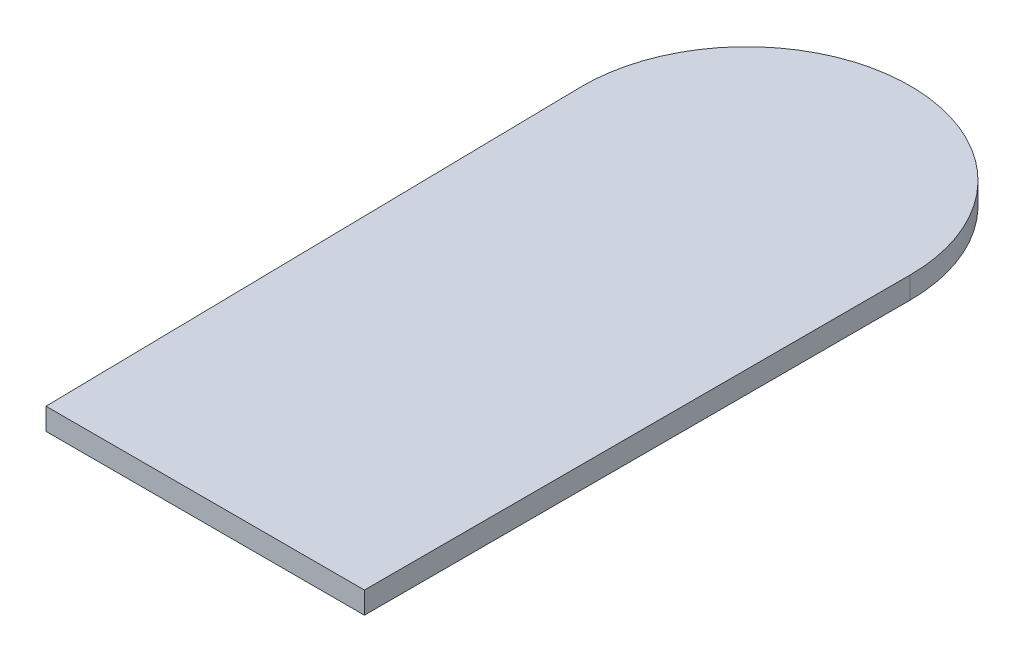
ISO-10303-21;
HEADER;
FILE_DESCRIPTION(('STEP AP214'),'2;1');
FILE_NAME('part.step','',(''),(''),'','','');
FILE_SCHEMA(('AUTOMOTIVE_DESIGN { 1 0 10303 214 1 1 1 1 }'));
ENDSEC;
DATA;
#1=APPLICATION_CONTEXT('core data for automotive mechanical design processes');
#2=APPLICATION_PROTOCOL_DEFINITION('international standard','automotive_design',2000,#1);
#3=PRODUCT_CONTEXT('',#1,'mechanical');
#4=PRODUCT('Part','Part','',(#3));
#5=PRODUCT_RELATED_PRODUCT_CATEGORY('part','',(#4));
#6=PRODUCT_DEFINITION_FORMATION('','',#4);
#7=PRODUCT_DEFINITION_CONTEXT('part definition',#1,'design');
#8=PRODUCT_DEFINITION('design','',#6,#7);
#9=PRODUCT_DEFINITION_SHAPE('','',#8);
#10=(LENGTH_UNIT() NAMED_UNIT(*) SI_UNIT(.MILLI.,.METRE.));
#11=(NAMED_UNIT(*) PLANE_ANGLE_UNIT() SI_UNIT($,.RADIAN.));
#12=(NAMED_UNIT(*) SI_UNIT($,.STERADIAN.) SOLID_ANGLE_UNIT());
#13=UNCERTAINTY_MEASURE_WITH_UNIT(LENGTH_MEASURE(1.E-05),#10,'distance_accuracy_value','');
#14=(GEOMETRIC_REPRESENTATION_CONTEXT(3) GLOBAL_UNCERTAINTY_ASSIGNED_CONTEXT((#13)) GLOBAL_UNIT_ASSIGNED_CONTEXT((#10,
#11,#12)) REPRESENTATION_CONTEXT('',''));
#15=CARTESIAN_POINT('',(0.,0.,0.));
#16=DIRECTION('',(0.,0.,1.));
#17=DIRECTION('',(1.,0.,0.));
#18=AXIS2_PLACEMENT_3D('',#15,#16,#17);
#19=CARTESIAN_POINT('',(-22.4968800304198,3.,0.374685063620242));
#20=DIRECTION('',(0.999861334685323,0.,-0.0166526694942331));
#21=DIRECTION('',(-0.0166526694942331,0.,-0.999861334685323));
#22=AXIS2_PLACEMENT_3D('',#19,#20,#21);
#23=PLANE('',#22);
#24=DIRECTION('',(0.0166526694942331,0.,0.999861334685323));
#25=VECTOR('',#24,1.);
#26=CARTESIAN_POINT('',(-22.4968800304198,0.,0.374685063620242));
#27=LINE('',#26,#25);
#28=CARTESIAN_POINT('',(-22.4968800304198,0.,0.374685063620237));
#29=VERTEX_POINT('',#28);
#30=CARTESIAN_POINT('',(-21.2539969801119,0.,75.));
#31=VERTEX_POINT('',#30);
#32=EDGE_CURVE('E102',#29,#31,#27,.T.);
#33=ORIENTED_EDGE('',*,*,#32,.T.);
#34=DIRECTION('',(0.,-1.,0.));
#35=VECTOR('',#34,1.);
#36=CARTESIAN_POINT('',(-21.2539969801119,3.,75.));
#37=LINE('',#36,#35);
#38=CARTESIAN_POINT('',(-21.2539969801119,3.,75.));
#39=VERTEX_POINT('',#38);
#40=EDGE_CURVE('E11',#39,#31,#37,.T.);
#41=ORIENTED_EDGE('',*,*,#40,.F.);
#42=DIRECTION('',(0.0166526694942331,0.,0.999861334685323));
#43=VECTOR('',#42,1.);
#44=CARTESIAN_POINT('',(-22.4968800304198,3.,0.374685063620242));
#45=LINE('',#44,#43);
#46=CARTESIAN_POINT('',(-22.4968800304198,3.,0.374685063620237));
#47=VERTEX_POINT('',#46);
#48=EDGE_CURVE('E88',#47,#39,#45,.T.);
#49=ORIENTED_EDGE('',*,*,#48,.F.);
#50=DIRECTION('',(0.,-1.,0.));
#51=VECTOR('',#50,1.);
#52=CARTESIAN_POINT('',(-22.4968800304198,3.,0.374685063620237));
#53=LINE('',#52,#51);
#54=EDGE_CURVE('E55',#47,#29,#53,.T.);
#55=ORIENTED_EDGE('',*,*,#54,.T.);
#56=EDGE_LOOP('',(#33,#41,#49,#55));
#57=FACE_BOUND('',#56,.T.);
#58=ADVANCED_FACE('F39',(#57),#23,.F.);
#59=CARTESIAN_POINT('',(-21.2539969801119,3.,75.));
#60=DIRECTION('',(0.,0.,-1.));
#61=DIRECTION('',(-1.,0.,0.));
#62=AXIS2_PLACEMENT_3D('',#59,#60,#61);
#63=PLANE('',#62);
#64=DIRECTION('',(1.,0.,0.));
#65=VECTOR('',#64,1.);
#66=CARTESIAN_POINT('',(-21.2539969801119,0.,75.));
#67=LINE('',#66,#65);
#68=CARTESIAN_POINT('',(22.5,0.,75.));
#69=VERTEX_POINT('',#68);
#70=EDGE_CURVE('E93',#31,#69,#67,.T.);
#71=ORIENTED_EDGE('',*,*,#70,.T.);
#72=DIRECTION('',(0.,-1.,0.));
#73=VECTOR('',#72,1.);
#74=CARTESIAN_POINT('',(22.5,3.,75.));
#75=LINE('',#74,#73);
#76=CARTESIAN_POINT('',(22.5,3.,75.));
#77=VERTEX_POINT('',#76);
#78=EDGE_CURVE('E47',#77,#69,#75,.T.);
#79=ORIENTED_EDGE('',*,*,#78,.F.);
#80=DIRECTION('',(1.,0.,0.));
#81=VECTOR('',#80,1.);
#82=CARTESIAN_POINT('',(-21.2539969801119,3.,75.));
#83=LINE('',#82,#81);
#84=EDGE_CURVE('E81',#39,#77,#83,.T.);
#85=ORIENTED_EDGE('',*,*,#84,.F.);
#86=ORIENTED_EDGE('',*,*,#40,.T.);
#87=EDGE_LOOP('',(#71,#79,#85,#86));
#88=FACE_BOUND('',#87,.T.);
#89=ADVANCED_FACE('F92',(#88),#63,.F.);
#90=CARTESIAN_POINT('',(22.5,3.,75.));
#91=DIRECTION('',(-1.,0.,0.));
#92=DIRECTION('',(0.,0.,1.));
#93=AXIS2_PLACEMENT_3D('',#90,#91,#92);
#94=PLANE('',#93);
#95=DIRECTION('',(0.,0.,-1.));
#96=VECTOR('',#95,1.);
#97=CARTESIAN_POINT('',(22.5,0.,75.));
#98=LINE('',#97,#96);
#99=CARTESIAN_POINT('',(22.5,0.,0.));
#100=VERTEX_POINT('',#99);
#101=EDGE_CURVE('E105',#69,#100,#98,.T.);
#102=ORIENTED_EDGE('',*,*,#101,.T.);
#103=DIRECTION('',(0.,-1.,0.));
#104=VECTOR('',#103,1.);
#105=CARTESIAN_POINT('',(22.5,3.,0.));
#106=LINE('',#105,#104);
#107=CARTESIAN_POINT('',(22.5,3.,0.));
#108=VERTEX_POINT('',#107);
#109=EDGE_CURVE('E70',#108,#100,#106,.T.);
#110=ORIENTED_EDGE('',*,*,#109,.F.);
#111=DIRECTION('',(0.,0.,-1.));
#112=VECTOR('',#111,1.);
#113=CARTESIAN_POINT('',(22.5,3.,75.));
#114=LINE('',#113,#112);
#115=EDGE_CURVE('E87',#77,#108,#114,.T.);
#116=ORIENTED_EDGE('',*,*,#115,.F.);
#117=ORIENTED_EDGE('',*,*,#78,.T.);
#118=EDGE_LOOP('',(#102,#110,#116,#117));
#119=FACE_BOUND('',#118,.T.);
#120=ADVANCED_FACE('F96',(#119),#94,.F.);
#121=CARTESIAN_POINT('',(0.,3.,0.));
#122=DIRECTION('',(0.,-1.,0.));
#123=DIRECTION('',(0.,0.,-1.));
#124=AXIS2_PLACEMENT_3D('',#121,#122,#123);
#125=CYLINDRICAL_SURFACE('',#124,22.5);
#126=CARTESIAN_POINT('',(0.,0.,0.));
#127=DIRECTION('',(0.,-1.,0.));
#128=DIRECTION('',(0.,0.,-1.));
#129=AXIS2_PLACEMENT_3D('',#126,#127,#128);
#130=CIRCLE('',#129,22.5);
#131=EDGE_CURVE('E107',#29,#100,#130,.T.);
#132=ORIENTED_EDGE('',*,*,#131,.F.);
#133=ORIENTED_EDGE('',*,*,#54,.F.);
#134=CARTESIAN_POINT('',(0.,3.,0.));
#135=DIRECTION('',(0.,-1.,0.));
#136=DIRECTION('',(0.,0.,-1.));
#137=AXIS2_PLACEMENT_3D('',#134,#135,#136);
#138=CIRCLE('',#137,22.5);
#139=EDGE_CURVE('E97',#47,#108,#138,.T.);
#140=ORIENTED_EDGE('',*,*,#139,.T.);
#141=ORIENTED_EDGE('',*,*,#109,.T.);
#142=EDGE_LOOP('',(#132,#133,#140,#141));
#143=FACE_BOUND('',#142,.T.);
#144=ADVANCED_FACE('F113',(#143),#125,.T.);
#145=CARTESIAN_POINT('',(0.,3.,0.));
#146=DIRECTION('',(0.,-1.,0.));
#147=DIRECTION('',(0.,0.,-1.));
#148=AXIS2_PLACEMENT_3D('',#145,#146,#147);
#149=PLANE('',#148);
#150=ORIENTED_EDGE('',*,*,#48,.T.);
#151=ORIENTED_EDGE('',*,*,#84,.T.);
#152=ORIENTED_EDGE('',*,*,#115,.T.);
#153=ORIENTED_EDGE('',*,*,#139,.F.);
#154=EDGE_LOOP('',(#150,#151,#152,#153));
#155=FACE_BOUND('',#154,.T.);
#156=ADVANCED_FACE('F84',(#155),#149,.F.);
#157=CARTESIAN_POINT('',(0.,0.,0.));
#158=DIRECTION('',(0.,-1.,0.));
#159=DIRECTION('',(0.,0.,-1.));
#160=AXIS2_PLACEMENT_3D('',#157,#158,#159);
#161=PLANE('',#160);
#162=ORIENTED_EDGE('',*,*,#32,.F.);
#163=ORIENTED_EDGE('',*,*,#131,.T.);
#164=ORIENTED_EDGE('',*,*,#101,.F.);
#165=ORIENTED_EDGE('',*,*,#70,.F.);
#166=EDGE_LOOP('',(#162,#163,#164,#165));
#167=FACE_BOUND('',#166,.T.);
#168=ADVANCED_FACE('F112',(#167),#161,.T.);
#169=CLOSED_SHELL('',(#58,#89,#120,#144,#156,#168));
#170=MANIFOLD_SOLID_BREP('B2',#169);
#171=ADVANCED_BREP_SHAPE_REPRESENTATION('',(#18,#170),#14);
#172=SHAPE_DEFINITION_REPRESENTATION(#9,#171);
ENDSEC;
END-ISO-10303-21;
